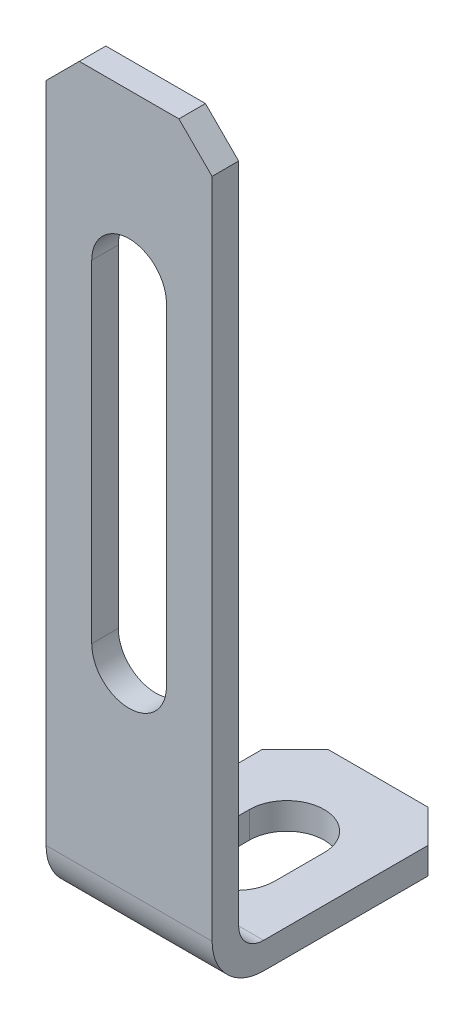
ISO-10303-21;
HEADER;
FILE_DESCRIPTION(('STEP AP214'),'2;1');
FILE_NAME('part.step','',(''),(''),'','','');
FILE_SCHEMA(('AUTOMOTIVE_DESIGN { 1 0 10303 214 1 1 1 1 }'));
ENDSEC;
DATA;
#1=APPLICATION_CONTEXT('core data for automotive mechanical design processes');
#2=APPLICATION_PROTOCOL_DEFINITION('international standard','automotive_design',2000,#1);
#3=PRODUCT_CONTEXT('',#1,'mechanical');
#4=PRODUCT('Part','Part','',(#3));
#5=PRODUCT_RELATED_PRODUCT_CATEGORY('part','',(#4));
#6=PRODUCT_DEFINITION_FORMATION('','',#4);
#7=PRODUCT_DEFINITION_CONTEXT('part definition',#1,'design');
#8=PRODUCT_DEFINITION('design','',#6,#7);
#9=PRODUCT_DEFINITION_SHAPE('','',#8);
#10=(LENGTH_UNIT() NAMED_UNIT(*) SI_UNIT(.MILLI.,.METRE.));
#11=(NAMED_UNIT(*) PLANE_ANGLE_UNIT() SI_UNIT($,.RADIAN.));
#12=(NAMED_UNIT(*) SI_UNIT($,.STERADIAN.) SOLID_ANGLE_UNIT());
#13=UNCERTAINTY_MEASURE_WITH_UNIT(LENGTH_MEASURE(1.E-05),#10,'distance_accuracy_value','');
#14=(GEOMETRIC_REPRESENTATION_CONTEXT(3) GLOBAL_UNCERTAINTY_ASSIGNED_CONTEXT((#13)) GLOBAL_UNIT_ASSIGNED_CONTEXT((#10,
#11,#12)) REPRESENTATION_CONTEXT('',''));
#15=CARTESIAN_POINT('',(0.,0.,0.));
#16=DIRECTION('',(0.,0.,1.));
#17=DIRECTION('',(1.,0.,0.));
#18=AXIS2_PLACEMENT_3D('',#15,#16,#17);
#19=CARTESIAN_POINT('',(0.,45.,-15.));
#20=DIRECTION('',(0.,1.,0.));
#21=DIRECTION('',(0.,0.,1.));
#22=AXIS2_PLACEMENT_3D('',#19,#20,#21);
#23=PLANE('',#22);
#24=DIRECTION('',(-1.,0.,0.));
#25=VECTOR('',#24,1.);
#26=CARTESIAN_POINT('',(10.,45.,-1.6));
#27=LINE('',#26,#25);
#28=CARTESIAN_POINT('',(8.00000000000001,45.,-1.6));
#29=VERTEX_POINT('',#28);
#30=CARTESIAN_POINT('',(1.99999999999999,45.,-1.6));
#31=VERTEX_POINT('',#30);
#32=EDGE_CURVE('E245',#29,#31,#27,.T.);
#33=ORIENTED_EDGE('',*,*,#32,.T.);
#34=DIRECTION('',(0.,0.,1.));
#35=VECTOR('',#34,1.);
#36=CARTESIAN_POINT('',(1.99999999999999,45.,0.));
#37=LINE('',#36,#35);
#38=CARTESIAN_POINT('',(1.99999999999999,45.,0.));
#39=VERTEX_POINT('',#38);
#40=EDGE_CURVE('E276',#31,#39,#37,.T.);
#41=ORIENTED_EDGE('',*,*,#40,.T.);
#42=DIRECTION('',(1.,0.,0.));
#43=VECTOR('',#42,1.);
#44=CARTESIAN_POINT('',(0.,45.,0.));
#45=LINE('',#44,#43);
#46=CARTESIAN_POINT('',(8.00000000000001,45.,0.));
#47=VERTEX_POINT('',#46);
#48=EDGE_CURVE('E257',#39,#47,#45,.T.);
#49=ORIENTED_EDGE('',*,*,#48,.T.);
#50=DIRECTION('',(0.,0.,-1.));
#51=VECTOR('',#50,1.);
#52=CARTESIAN_POINT('',(8.00000000000001,45.,-15.));
#53=LINE('',#52,#51);
#54=EDGE_CURVE('E274',#47,#29,#53,.T.);
#55=ORIENTED_EDGE('',*,*,#54,.T.);
#56=EDGE_LOOP('',(#33,#41,#49,#55));
#57=FACE_BOUND('',#56,.T.);
#58=ADVANCED_FACE('F32',(#57),#23,.T.);
#59=CARTESIAN_POINT('',(0.,0.,-15.));
#60=DIRECTION('',(0.,0.,-1.));
#61=DIRECTION('',(-1.,0.,0.));
#62=AXIS2_PLACEMENT_3D('',#59,#60,#61);
#63=PLANE('',#62);
#64=DIRECTION('',(1.,0.,0.));
#65=VECTOR('',#64,1.);
#66=CARTESIAN_POINT('',(0.,0.,-15.));
#67=LINE('',#66,#65);
#68=CARTESIAN_POINT('',(1.99999999999999,0.,-15.));
#69=VERTEX_POINT('',#68);
#70=CARTESIAN_POINT('',(8.,0.,-15.));
#71=VERTEX_POINT('',#70);
#72=EDGE_CURVE('E260',#69,#71,#67,.T.);
#73=ORIENTED_EDGE('',*,*,#72,.F.);
#74=DIRECTION('',(0.,1.,0.));
#75=VECTOR('',#74,1.);
#76=CARTESIAN_POINT('',(1.99999999999999,1.6,-15.));
#77=LINE('',#76,#75);
#78=CARTESIAN_POINT('',(1.99999999999999,1.6,-15.));
#79=VERTEX_POINT('',#78);
#80=EDGE_CURVE('E296',#69,#79,#77,.T.);
#81=ORIENTED_EDGE('',*,*,#80,.T.);
#82=DIRECTION('',(-1.,0.,0.));
#83=VECTOR('',#82,1.);
#84=CARTESIAN_POINT('',(10.,1.6,-15.));
#85=LINE('',#84,#83);
#86=CARTESIAN_POINT('',(8.00000000000001,1.6,-15.));
#87=VERTEX_POINT('',#86);
#88=EDGE_CURVE('E241',#87,#79,#85,.T.);
#89=ORIENTED_EDGE('',*,*,#88,.F.);
#90=DIRECTION('',(0.,-1.,0.));
#91=VECTOR('',#90,1.);
#92=CARTESIAN_POINT('',(8.00000000000001,0.,-15.));
#93=LINE('',#92,#91);
#94=EDGE_CURVE('E294',#87,#71,#93,.T.);
#95=ORIENTED_EDGE('',*,*,#94,.T.);
#96=EDGE_LOOP('',(#73,#81,#89,#95));
#97=FACE_BOUND('',#96,.T.);
#98=ADVANCED_FACE('F356',(#97),#63,.T.);
#99=CARTESIAN_POINT('',(0.,0.,0.));
#100=DIRECTION('',(0.,-1.,0.));
#101=DIRECTION('',(0.,0.,-1.));
#102=AXIS2_PLACEMENT_3D('',#99,#100,#101);
#103=PLANE('',#102);
#104=CARTESIAN_POINT('',(5.,0.,-9.5));
#105=DIRECTION('',(0.,1.,0.));
#106=DIRECTION('',(0.,0.,1.));
#107=AXIS2_PLACEMENT_3D('',#104,#105,#106);
#108=CIRCLE('',#107,2.25);
#109=CARTESIAN_POINT('',(7.25,0.,-9.5));
#110=VERTEX_POINT('',#109);
#111=CARTESIAN_POINT('',(2.75,0.,-9.5));
#112=VERTEX_POINT('',#111);
#113=EDGE_CURVE('E203',#110,#112,#108,.T.);
#114=ORIENTED_EDGE('',*,*,#113,.T.);
#115=DIRECTION('',(0.,0.,1.));
#116=VECTOR('',#115,1.);
#117=CARTESIAN_POINT('',(2.75,0.,-9.5));
#118=LINE('',#117,#116);
#119=CARTESIAN_POINT('',(2.75,0.,-6.5));
#120=VERTEX_POINT('',#119);
#121=EDGE_CURVE('E206',#112,#120,#118,.T.);
#122=ORIENTED_EDGE('',*,*,#121,.T.);
#123=CARTESIAN_POINT('',(5.,0.,-6.5));
#124=DIRECTION('',(0.,1.,0.));
#125=DIRECTION('',(0.,0.,1.));
#126=AXIS2_PLACEMENT_3D('',#123,#124,#125);
#127=CIRCLE('',#126,2.25);
#128=CARTESIAN_POINT('',(7.25,0.,-6.5));
#129=VERTEX_POINT('',#128);
#130=EDGE_CURVE('E210',#120,#129,#127,.T.);
#131=ORIENTED_EDGE('',*,*,#130,.T.);
#132=DIRECTION('',(0.,0.,-1.));
#133=VECTOR('',#132,1.);
#134=CARTESIAN_POINT('',(7.25,0.,-6.5));
#135=LINE('',#134,#133);
#136=EDGE_CURVE('E213',#129,#110,#135,.T.);
#137=ORIENTED_EDGE('',*,*,#136,.T.);
#138=EDGE_LOOP('',(#114,#122,#131,#137));
#139=FACE_BOUND('',#138,.T.);
#140=DIRECTION('',(0.,0.,-1.));
#141=VECTOR('',#140,1.);
#142=CARTESIAN_POINT('',(10.,0.,0.));
#143=LINE('',#142,#141);
#144=CARTESIAN_POINT('',(10.,0.,-3.1));
#145=VERTEX_POINT('',#144);
#146=CARTESIAN_POINT('',(10.,0.,-13.));
#147=VERTEX_POINT('',#146);
#148=EDGE_CURVE('E255',#145,#147,#143,.T.);
#149=ORIENTED_EDGE('',*,*,#148,.F.);
#150=DIRECTION('',(1.,0.,0.));
#151=VECTOR('',#150,1.);
#152=CARTESIAN_POINT('',(0.,0.,-3.1));
#153=LINE('',#152,#151);
#154=CARTESIAN_POINT('',(0.,0.,-3.1));
#155=VERTEX_POINT('',#154);
#156=EDGE_CURVE('E40',#145,#155,#153,.F.);
#157=ORIENTED_EDGE('',*,*,#156,.T.);
#158=DIRECTION('',(0.,0.,-1.));
#159=VECTOR('',#158,1.);
#160=CARTESIAN_POINT('',(0.,0.,0.));
#161=LINE('',#160,#159);
#162=CARTESIAN_POINT('',(0.,0.,-13.));
#163=VERTEX_POINT('',#162);
#164=EDGE_CURVE('E254',#155,#163,#161,.T.);
#165=ORIENTED_EDGE('',*,*,#164,.T.);
#166=DIRECTION('',(0.707106781186546,0.,-0.707106781186549));
#167=VECTOR('',#166,1.);
#168=CARTESIAN_POINT('',(-6.5,0.,-6.49999999999998));
#169=LINE('',#168,#167);
#170=EDGE_CURVE('E306',#163,#69,#169,.T.);
#171=ORIENTED_EDGE('',*,*,#170,.T.);
#172=ORIENTED_EDGE('',*,*,#72,.T.);
#173=DIRECTION('',(-0.707106781186549,0.,-0.707106781186546));
#174=VECTOR('',#173,1.);
#175=CARTESIAN_POINT('',(11.5,0.,-11.5));
#176=LINE('',#175,#174);
#177=EDGE_CURVE('E303',#71,#147,#176,.F.);
#178=ORIENTED_EDGE('',*,*,#177,.T.);
#179=EDGE_LOOP('',(#149,#157,#165,#171,#172,#178));
#180=FACE_BOUND('',#179,.T.);
#181=ADVANCED_FACE('F361',(#139,#180),#103,.T.);
#182=CARTESIAN_POINT('',(0.,45.,0.));
#183=DIRECTION('',(0.,0.,1.));
#184=DIRECTION('',(1.,0.,0.));
#185=AXIS2_PLACEMENT_3D('',#182,#183,#184);
#186=PLANE('',#185);
#187=CARTESIAN_POINT('',(5.,15.,0.));
#188=DIRECTION('',(0.,0.,1.));
#189=DIRECTION('',(1.,0.,0.));
#190=AXIS2_PLACEMENT_3D('',#187,#188,#189);
#191=CIRCLE('',#190,2.25);
#192=CARTESIAN_POINT('',(2.75,15.,0.));
#193=VERTEX_POINT('',#192);
#194=CARTESIAN_POINT('',(7.25,15.,0.));
#195=VERTEX_POINT('',#194);
#196=EDGE_CURVE('E188',#193,#195,#191,.T.);
#197=ORIENTED_EDGE('',*,*,#196,.F.);
#198=DIRECTION('',(0.,-1.,0.));
#199=VECTOR('',#198,1.);
#200=CARTESIAN_POINT('',(2.75,35.,0.));
#201=LINE('',#200,#199);
#202=CARTESIAN_POINT('',(2.75,35.,0.));
#203=VERTEX_POINT('',#202);
#204=EDGE_CURVE('E193',#203,#193,#201,.T.);
#205=ORIENTED_EDGE('',*,*,#204,.F.);
#206=CARTESIAN_POINT('',(5.,35.,0.));
#207=DIRECTION('',(0.,0.,1.));
#208=DIRECTION('',(1.,0.,0.));
#209=AXIS2_PLACEMENT_3D('',#206,#207,#208);
#210=CIRCLE('',#209,2.25);
#211=CARTESIAN_POINT('',(7.25,35.,0.));
#212=VERTEX_POINT('',#211);
#213=EDGE_CURVE('E172',#212,#203,#210,.T.);
#214=ORIENTED_EDGE('',*,*,#213,.F.);
#215=DIRECTION('',(0.,1.,0.));
#216=VECTOR('',#215,1.);
#217=CARTESIAN_POINT('',(7.25,15.,0.));
#218=LINE('',#217,#216);
#219=EDGE_CURVE('E183',#195,#212,#218,.T.);
#220=ORIENTED_EDGE('',*,*,#219,.F.);
#221=EDGE_LOOP('',(#197,#205,#214,#220));
#222=FACE_BOUND('',#221,.T.);
#223=DIRECTION('',(0.,-1.,0.));
#224=VECTOR('',#223,1.);
#225=CARTESIAN_POINT('',(0.,45.,0.));
#226=LINE('',#225,#224);
#227=CARTESIAN_POINT('',(0.,43.,0.));
#228=VERTEX_POINT('',#227);
#229=CARTESIAN_POINT('',(0.,3.10000000000001,0.));
#230=VERTEX_POINT('',#229);
#231=EDGE_CURVE('E251',#228,#230,#226,.T.);
#232=ORIENTED_EDGE('',*,*,#231,.T.);
#233=DIRECTION('',(1.,0.,0.));
#234=VECTOR('',#233,1.);
#235=CARTESIAN_POINT('',(0.,3.1,0.));
#236=LINE('',#235,#234);
#237=CARTESIAN_POINT('',(10.,3.10000000000001,0.));
#238=VERTEX_POINT('',#237);
#239=EDGE_CURVE('E323',#230,#238,#236,.T.);
#240=ORIENTED_EDGE('',*,*,#239,.T.);
#241=DIRECTION('',(0.,-1.,0.));
#242=VECTOR('',#241,1.);
#243=CARTESIAN_POINT('',(10.,45.,0.));
#244=LINE('',#243,#242);
#245=CARTESIAN_POINT('',(10.,43.,0.));
#246=VERTEX_POINT('',#245);
#247=EDGE_CURVE('E248',#246,#238,#244,.T.);
#248=ORIENTED_EDGE('',*,*,#247,.F.);
#249=DIRECTION('',(0.70710678118655,-0.707106781186545,0.));
#250=VECTOR('',#249,1.);
#251=CARTESIAN_POINT('',(3.99999999999998,49.,0.));
#252=LINE('',#251,#250);
#253=EDGE_CURVE('E279',#246,#47,#252,.F.);
#254=ORIENTED_EDGE('',*,*,#253,.T.);
#255=ORIENTED_EDGE('',*,*,#48,.F.);
#256=DIRECTION('',(-0.707106781186546,-0.707106781186549,0.));
#257=VECTOR('',#256,1.);
#258=CARTESIAN_POINT('',(0.999999999999997,44.,0.));
#259=LINE('',#258,#257);
#260=EDGE_CURVE('E281',#39,#228,#259,.T.);
#261=ORIENTED_EDGE('',*,*,#260,.T.);
#262=EDGE_LOOP('',(#232,#240,#248,#254,#255,#261));
#263=FACE_BOUND('',#262,.T.);
#264=ADVANCED_FACE('F190',(#222,#263),#186,.T.);
#265=CARTESIAN_POINT('',(0.,0.,0.));
#266=DIRECTION('',(1.,0.,0.));
#267=DIRECTION('',(0.,0.,-1.));
#268=AXIS2_PLACEMENT_3D('',#265,#266,#267);
#269=PLANE('',#268);
#270=ORIENTED_EDGE('',*,*,#164,.F.);
#271=CARTESIAN_POINT('',(0.,3.1,-3.1));
#272=DIRECTION('',(1.,0.,0.));
#273=DIRECTION('',(0.,0.,-1.));
#274=AXIS2_PLACEMENT_3D('',#271,#272,#273);
#275=CIRCLE('',#274,3.1);
#276=EDGE_CURVE('E11',#155,#230,#275,.F.);
#277=ORIENTED_EDGE('',*,*,#276,.T.);
#278=ORIENTED_EDGE('',*,*,#231,.F.);
#279=DIRECTION('',(0.,0.,-1.));
#280=VECTOR('',#279,1.);
#281=CARTESIAN_POINT('',(0.,43.,-1.6));
#282=LINE('',#281,#280);
#283=CARTESIAN_POINT('',(0.,43.,-1.6));
#284=VERTEX_POINT('',#283);
#285=EDGE_CURVE('E286',#228,#284,#282,.T.);
#286=ORIENTED_EDGE('',*,*,#285,.T.);
#287=DIRECTION('',(0.,1.,0.));
#288=VECTOR('',#287,1.);
#289=CARTESIAN_POINT('',(0.,1.6,-1.6));
#290=LINE('',#289,#288);
#291=CARTESIAN_POINT('',(0.,3.1,-1.6));
#292=VERTEX_POINT('',#291);
#293=EDGE_CURVE('E239',#292,#284,#290,.T.);
#294=ORIENTED_EDGE('',*,*,#293,.F.);
#295=CARTESIAN_POINT('',(0.,3.1,-3.1));
#296=DIRECTION('',(1.,0.,0.));
#297=DIRECTION('',(0.,0.,-1.));
#298=AXIS2_PLACEMENT_3D('',#295,#296,#297);
#299=CIRCLE('',#298,1.5);
#300=CARTESIAN_POINT('',(0.,1.6,-3.1));
#301=VERTEX_POINT('',#300);
#302=EDGE_CURVE('E319',#292,#301,#299,.T.);
#303=ORIENTED_EDGE('',*,*,#302,.T.);
#304=DIRECTION('',(0.,0.,1.));
#305=VECTOR('',#304,1.);
#306=CARTESIAN_POINT('',(0.,1.6,-15.));
#307=LINE('',#306,#305);
#308=CARTESIAN_POINT('',(0.,1.6,-13.));
#309=VERTEX_POINT('',#308);
#310=EDGE_CURVE('E228',#309,#301,#307,.T.);
#311=ORIENTED_EDGE('',*,*,#310,.F.);
#312=DIRECTION('',(0.,-1.,0.));
#313=VECTOR('',#312,1.);
#314=CARTESIAN_POINT('',(0.,0.,-13.));
#315=LINE('',#314,#313);
#316=EDGE_CURVE('E283',#309,#163,#315,.T.);
#317=ORIENTED_EDGE('',*,*,#316,.T.);
#318=EDGE_LOOP('',(#270,#277,#278,#286,#294,#303,#311,#317));
#319=FACE_BOUND('',#318,.T.);
#320=ADVANCED_FACE('F347',(#319),#269,.F.);
#321=CARTESIAN_POINT('',(10.,0.,0.));
#322=DIRECTION('',(1.,0.,0.));
#323=DIRECTION('',(0.,0.,-1.));
#324=AXIS2_PLACEMENT_3D('',#321,#322,#323);
#325=PLANE('',#324);
#326=ORIENTED_EDGE('',*,*,#247,.T.);
#327=CARTESIAN_POINT('',(10.,3.1,-3.1));
#328=DIRECTION('',(1.,0.,0.));
#329=DIRECTION('',(0.,0.,-1.));
#330=AXIS2_PLACEMENT_3D('',#327,#328,#329);
#331=CIRCLE('',#330,3.1);
#332=EDGE_CURVE('E54',#238,#145,#331,.T.);
#333=ORIENTED_EDGE('',*,*,#332,.T.);
#334=ORIENTED_EDGE('',*,*,#148,.T.);
#335=DIRECTION('',(0.,1.,0.));
#336=VECTOR('',#335,1.);
#337=CARTESIAN_POINT('',(10.,0.,-13.));
#338=LINE('',#337,#336);
#339=CARTESIAN_POINT('',(10.,1.6,-13.));
#340=VERTEX_POINT('',#339);
#341=EDGE_CURVE('E311',#147,#340,#338,.T.);
#342=ORIENTED_EDGE('',*,*,#341,.T.);
#343=DIRECTION('',(0.,0.,1.));
#344=VECTOR('',#343,1.);
#345=CARTESIAN_POINT('',(10.,1.6,-15.));
#346=LINE('',#345,#344);
#347=CARTESIAN_POINT('',(10.,1.6,-3.1));
#348=VERTEX_POINT('',#347);
#349=EDGE_CURVE('E235',#340,#348,#346,.T.);
#350=ORIENTED_EDGE('',*,*,#349,.T.);
#351=CARTESIAN_POINT('',(10.,3.1,-3.1));
#352=DIRECTION('',(1.,0.,0.));
#353=DIRECTION('',(0.,0.,-1.));
#354=AXIS2_PLACEMENT_3D('',#351,#352,#353);
#355=CIRCLE('',#354,1.5);
#356=CARTESIAN_POINT('',(10.,3.1,-1.6));
#357=VERTEX_POINT('',#356);
#358=EDGE_CURVE('E321',#348,#357,#355,.F.);
#359=ORIENTED_EDGE('',*,*,#358,.T.);
#360=DIRECTION('',(0.,1.,0.));
#361=VECTOR('',#360,1.);
#362=CARTESIAN_POINT('',(10.,1.6,-1.6));
#363=LINE('',#362,#361);
#364=CARTESIAN_POINT('',(10.,43.,-1.6));
#365=VERTEX_POINT('',#364);
#366=EDGE_CURVE('E238',#357,#365,#363,.T.);
#367=ORIENTED_EDGE('',*,*,#366,.T.);
#368=DIRECTION('',(0.,0.,1.));
#369=VECTOR('',#368,1.);
#370=CARTESIAN_POINT('',(10.,43.,0.));
#371=LINE('',#370,#369);
#372=EDGE_CURVE('E308',#365,#246,#371,.T.);
#373=ORIENTED_EDGE('',*,*,#372,.T.);
#374=EDGE_LOOP('',(#326,#333,#334,#342,#350,#359,#367,#373));
#375=FACE_BOUND('',#374,.T.);
#376=ADVANCED_FACE('F331',(#375),#325,.T.);
#377=CARTESIAN_POINT('',(10.,1.6,-1.6));
#378=DIRECTION('',(0.,0.,1.));
#379=DIRECTION('',(1.,0.,0.));
#380=AXIS2_PLACEMENT_3D('',#377,#378,#379);
#381=PLANE('',#380);
#382=DIRECTION('',(0.,-1.,0.));
#383=VECTOR('',#382,1.);
#384=CARTESIAN_POINT('',(2.75,1.6,-1.6));
#385=LINE('',#384,#383);
#386=CARTESIAN_POINT('',(2.75,35.,-1.6));
#387=VERTEX_POINT('',#386);
#388=CARTESIAN_POINT('',(2.75,15.,-1.6));
#389=VERTEX_POINT('',#388);
#390=EDGE_CURVE('E268',#387,#389,#385,.T.);
#391=ORIENTED_EDGE('',*,*,#390,.T.);
#392=CARTESIAN_POINT('',(5.,15.,-1.6));
#393=DIRECTION('',(0.,0.,1.));
#394=DIRECTION('',(1.,0.,0.));
#395=AXIS2_PLACEMENT_3D('',#392,#393,#394);
#396=CIRCLE('',#395,2.25);
#397=CARTESIAN_POINT('',(7.25,15.,-1.6));
#398=VERTEX_POINT('',#397);
#399=EDGE_CURVE('E271',#389,#398,#396,.T.);
#400=ORIENTED_EDGE('',*,*,#399,.T.);
#401=DIRECTION('',(0.,1.,0.));
#402=VECTOR('',#401,1.);
#403=CARTESIAN_POINT('',(7.25,1.6,-1.6));
#404=LINE('',#403,#402);
#405=CARTESIAN_POINT('',(7.25,35.,-1.6));
#406=VERTEX_POINT('',#405);
#407=EDGE_CURVE('E263',#398,#406,#404,.T.);
#408=ORIENTED_EDGE('',*,*,#407,.T.);
#409=CARTESIAN_POINT('',(5.,35.,-1.6));
#410=DIRECTION('',(0.,0.,1.));
#411=DIRECTION('',(1.,0.,0.));
#412=AXIS2_PLACEMENT_3D('',#409,#410,#411);
#413=CIRCLE('',#412,2.25);
#414=EDGE_CURVE('E175',#406,#387,#413,.T.);
#415=ORIENTED_EDGE('',*,*,#414,.T.);
#416=EDGE_LOOP('',(#391,#400,#408,#415));
#417=FACE_BOUND('',#416,.T.);
#418=ORIENTED_EDGE('',*,*,#366,.F.);
#419=DIRECTION('',(-1.,0.,0.));
#420=VECTOR('',#419,1.);
#421=CARTESIAN_POINT('',(0.,3.1,-1.6));
#422=LINE('',#421,#420);
#423=EDGE_CURVE('E314',#357,#292,#422,.T.);
#424=ORIENTED_EDGE('',*,*,#423,.T.);
#425=ORIENTED_EDGE('',*,*,#293,.T.);
#426=DIRECTION('',(0.707106781186546,0.707106781186549,0.));
#427=VECTOR('',#426,1.);
#428=CARTESIAN_POINT('',(1.99999999999999,45.,-1.6));
#429=LINE('',#428,#427);
#430=EDGE_CURVE('E292',#284,#31,#429,.T.);
#431=ORIENTED_EDGE('',*,*,#430,.T.);
#432=ORIENTED_EDGE('',*,*,#32,.F.);
#433=DIRECTION('',(-0.70710678118655,0.707106781186545,0.));
#434=VECTOR('',#433,1.);
#435=CARTESIAN_POINT('',(10.,43.,-1.6));
#436=LINE('',#435,#434);
#437=EDGE_CURVE('E289',#29,#365,#436,.F.);
#438=ORIENTED_EDGE('',*,*,#437,.T.);
#439=EDGE_LOOP('',(#418,#424,#425,#431,#432,#438));
#440=FACE_BOUND('',#439,.T.);
#441=ADVANCED_FACE('F425',(#417,#440),#381,.F.);
#442=CARTESIAN_POINT('',(10.,1.6,-15.));
#443=DIRECTION('',(0.,-1.,0.));
#444=DIRECTION('',(0.,0.,-1.));
#445=AXIS2_PLACEMENT_3D('',#442,#443,#444);
#446=PLANE('',#445);
#447=DIRECTION('',(0.,0.,1.));
#448=VECTOR('',#447,1.);
#449=CARTESIAN_POINT('',(2.75,1.6,-9.5));
#450=LINE('',#449,#448);
#451=CARTESIAN_POINT('',(2.75,1.6,-9.5));
#452=VERTEX_POINT('',#451);
#453=CARTESIAN_POINT('',(2.75,1.6,-6.5));
#454=VERTEX_POINT('',#453);
#455=EDGE_CURVE('E218',#452,#454,#450,.T.);
#456=ORIENTED_EDGE('',*,*,#455,.F.);
#457=CARTESIAN_POINT('',(5.,1.6,-9.5));
#458=DIRECTION('',(0.,1.,0.));
#459=DIRECTION('',(0.,0.,1.));
#460=AXIS2_PLACEMENT_3D('',#457,#458,#459);
#461=CIRCLE('',#460,2.25);
#462=CARTESIAN_POINT('',(7.25,1.6,-9.5));
#463=VERTEX_POINT('',#462);
#464=EDGE_CURVE('E200',#463,#452,#461,.T.);
#465=ORIENTED_EDGE('',*,*,#464,.F.);
#466=DIRECTION('',(0.,0.,-1.));
#467=VECTOR('',#466,1.);
#468=CARTESIAN_POINT('',(7.25,1.6,-6.5));
#469=LINE('',#468,#467);
#470=CARTESIAN_POINT('',(7.25,1.6,-6.5));
#471=VERTEX_POINT('',#470);
#472=EDGE_CURVE('E207',#471,#463,#469,.T.);
#473=ORIENTED_EDGE('',*,*,#472,.F.);
#474=CARTESIAN_POINT('',(5.,1.6,-6.5));
#475=DIRECTION('',(0.,1.,0.));
#476=DIRECTION('',(0.,0.,1.));
#477=AXIS2_PLACEMENT_3D('',#474,#475,#476);
#478=CIRCLE('',#477,2.25);
#479=EDGE_CURVE('E221',#454,#471,#478,.T.);
#480=ORIENTED_EDGE('',*,*,#479,.F.);
#481=EDGE_LOOP('',(#456,#465,#473,#480));
#482=FACE_BOUND('',#481,.T.);
#483=ORIENTED_EDGE('',*,*,#310,.T.);
#484=DIRECTION('',(-1.,0.,0.));
#485=VECTOR('',#484,1.);
#486=CARTESIAN_POINT('',(10.,1.6,-3.1));
#487=LINE('',#486,#485);
#488=EDGE_CURVE('E317',#301,#348,#487,.F.);
#489=ORIENTED_EDGE('',*,*,#488,.T.);
#490=ORIENTED_EDGE('',*,*,#349,.F.);
#491=DIRECTION('',(0.707106781186549,0.,0.707106781186546));
#492=VECTOR('',#491,1.);
#493=CARTESIAN_POINT('',(10.,1.6,-13.));
#494=LINE('',#493,#492);
#495=EDGE_CURVE('E299',#340,#87,#494,.F.);
#496=ORIENTED_EDGE('',*,*,#495,.T.);
#497=ORIENTED_EDGE('',*,*,#88,.T.);
#498=DIRECTION('',(-0.707106781186546,0.,0.707106781186549));
#499=VECTOR('',#498,1.);
#500=CARTESIAN_POINT('',(1.99999999999999,1.6,-15.));
#501=LINE('',#500,#499);
#502=EDGE_CURVE('E301',#79,#309,#501,.T.);
#503=ORIENTED_EDGE('',*,*,#502,.T.);
#504=EDGE_LOOP('',(#483,#489,#490,#496,#497,#503));
#505=FACE_BOUND('',#504,.T.);
#506=ADVANCED_FACE('F394',(#482,#505),#446,.F.);
#507=CARTESIAN_POINT('',(5.,0.,-9.5));
#508=DIRECTION('',(0.,1.,0.));
#509=DIRECTION('',(0.,0.,1.));
#510=AXIS2_PLACEMENT_3D('',#507,#508,#509);
#511=CYLINDRICAL_SURFACE('',#510,2.25);
#512=ORIENTED_EDGE('',*,*,#464,.T.);
#513=DIRECTION('',(0.,1.,0.));
#514=VECTOR('',#513,1.);
#515=CARTESIAN_POINT('',(2.75,0.,-9.5));
#516=LINE('',#515,#514);
#517=EDGE_CURVE('E216',#112,#452,#516,.T.);
#518=ORIENTED_EDGE('',*,*,#517,.F.);
#519=ORIENTED_EDGE('',*,*,#113,.F.);
#520=DIRECTION('',(0.,1.,0.));
#521=VECTOR('',#520,1.);
#522=CARTESIAN_POINT('',(7.25,0.,-9.5));
#523=LINE('',#522,#521);
#524=EDGE_CURVE('E226',#110,#463,#523,.T.);
#525=ORIENTED_EDGE('',*,*,#524,.T.);
#526=EDGE_LOOP('',(#512,#518,#519,#525));
#527=FACE_BOUND('',#526,.T.);
#528=ADVANCED_FACE('F441',(#527),#511,.F.);
#529=CARTESIAN_POINT('',(7.25,0.,-6.5));
#530=DIRECTION('',(1.,0.,0.));
#531=DIRECTION('',(0.,0.,-1.));
#532=AXIS2_PLACEMENT_3D('',#529,#530,#531);
#533=PLANE('',#532);
#534=ORIENTED_EDGE('',*,*,#472,.T.);
#535=ORIENTED_EDGE('',*,*,#524,.F.);
#536=ORIENTED_EDGE('',*,*,#136,.F.);
#537=DIRECTION('',(0.,1.,0.));
#538=VECTOR('',#537,1.);
#539=CARTESIAN_POINT('',(7.25,0.,-6.5));
#540=LINE('',#539,#538);
#541=EDGE_CURVE('E229',#129,#471,#540,.T.);
#542=ORIENTED_EDGE('',*,*,#541,.T.);
#543=EDGE_LOOP('',(#534,#535,#536,#542));
#544=FACE_BOUND('',#543,.T.);
#545=ADVANCED_FACE('F447',(#544),#533,.F.);
#546=CARTESIAN_POINT('',(5.,0.,-6.5));
#547=DIRECTION('',(0.,1.,0.));
#548=DIRECTION('',(0.,0.,1.));
#549=AXIS2_PLACEMENT_3D('',#546,#547,#548);
#550=CYLINDRICAL_SURFACE('',#549,2.25);
#551=ORIENTED_EDGE('',*,*,#479,.T.);
#552=ORIENTED_EDGE('',*,*,#541,.F.);
#553=ORIENTED_EDGE('',*,*,#130,.F.);
#554=DIRECTION('',(0.,1.,0.));
#555=VECTOR('',#554,1.);
#556=CARTESIAN_POINT('',(2.75,0.,-6.5));
#557=LINE('',#556,#555);
#558=EDGE_CURVE('E231',#120,#454,#557,.T.);
#559=ORIENTED_EDGE('',*,*,#558,.T.);
#560=EDGE_LOOP('',(#551,#552,#553,#559));
#561=FACE_BOUND('',#560,.T.);
#562=ADVANCED_FACE('F455',(#561),#550,.F.);
#563=CARTESIAN_POINT('',(2.75,0.,-9.5));
#564=DIRECTION('',(-1.,0.,0.));
#565=DIRECTION('',(0.,0.,1.));
#566=AXIS2_PLACEMENT_3D('',#563,#564,#565);
#567=PLANE('',#566);
#568=ORIENTED_EDGE('',*,*,#455,.T.);
#569=ORIENTED_EDGE('',*,*,#558,.F.);
#570=ORIENTED_EDGE('',*,*,#121,.F.);
#571=ORIENTED_EDGE('',*,*,#517,.T.);
#572=EDGE_LOOP('',(#568,#569,#570,#571));
#573=FACE_BOUND('',#572,.T.);
#574=ADVANCED_FACE('F463',(#573),#567,.F.);
#575=CARTESIAN_POINT('',(5.,15.,-15.));
#576=DIRECTION('',(0.,0.,1.));
#577=DIRECTION('',(1.,0.,0.));
#578=AXIS2_PLACEMENT_3D('',#575,#576,#577);
#579=CYLINDRICAL_SURFACE('',#578,2.25);
#580=DIRECTION('',(0.,0.,1.));
#581=VECTOR('',#580,1.);
#582=CARTESIAN_POINT('',(2.75,15.,-15.));
#583=LINE('',#582,#581);
#584=EDGE_CURVE('E198',#389,#193,#583,.T.);
#585=ORIENTED_EDGE('',*,*,#584,.T.);
#586=ORIENTED_EDGE('',*,*,#196,.T.);
#587=DIRECTION('',(0.,0.,1.));
#588=VECTOR('',#587,1.);
#589=CARTESIAN_POINT('',(7.25,15.,-15.));
#590=LINE('',#589,#588);
#591=EDGE_CURVE('E179',#398,#195,#590,.T.);
#592=ORIENTED_EDGE('',*,*,#591,.F.);
#593=ORIENTED_EDGE('',*,*,#399,.F.);
#594=EDGE_LOOP('',(#585,#586,#592,#593));
#595=FACE_BOUND('',#594,.T.);
#596=ADVANCED_FACE('F471',(#595),#579,.F.);
#597=CARTESIAN_POINT('',(2.75,35.,-15.));
#598=DIRECTION('',(-1.,0.,0.));
#599=DIRECTION('',(0.,0.,1.));
#600=AXIS2_PLACEMENT_3D('',#597,#598,#599);
#601=PLANE('',#600);
#602=DIRECTION('',(0.,0.,1.));
#603=VECTOR('',#602,1.);
#604=CARTESIAN_POINT('',(2.75,35.,-15.));
#605=LINE('',#604,#603);
#606=EDGE_CURVE('E178',#387,#203,#605,.T.);
#607=ORIENTED_EDGE('',*,*,#606,.T.);
#608=ORIENTED_EDGE('',*,*,#204,.T.);
#609=ORIENTED_EDGE('',*,*,#584,.F.);
#610=ORIENTED_EDGE('',*,*,#390,.F.);
#611=EDGE_LOOP('',(#607,#608,#609,#610));
#612=FACE_BOUND('',#611,.T.);
#613=ADVANCED_FACE('F479',(#612),#601,.F.);
#614=CARTESIAN_POINT('',(5.,35.,-15.));
#615=DIRECTION('',(0.,0.,1.));
#616=DIRECTION('',(1.,0.,0.));
#617=AXIS2_PLACEMENT_3D('',#614,#615,#616);
#618=CYLINDRICAL_SURFACE('',#617,2.25);
#619=DIRECTION('',(0.,0.,1.));
#620=VECTOR('',#619,1.);
#621=CARTESIAN_POINT('',(7.25,35.,-15.));
#622=LINE('',#621,#620);
#623=EDGE_CURVE('E167',#406,#212,#622,.T.);
#624=ORIENTED_EDGE('',*,*,#623,.T.);
#625=ORIENTED_EDGE('',*,*,#213,.T.);
#626=ORIENTED_EDGE('',*,*,#606,.F.);
#627=ORIENTED_EDGE('',*,*,#414,.F.);
#628=EDGE_LOOP('',(#624,#625,#626,#627));
#629=FACE_BOUND('',#628,.T.);
#630=ADVANCED_FACE('F169',(#629),#618,.F.);
#631=CARTESIAN_POINT('',(7.25,15.,-15.));
#632=DIRECTION('',(1.,0.,0.));
#633=DIRECTION('',(0.,0.,-1.));
#634=AXIS2_PLACEMENT_3D('',#631,#632,#633);
#635=PLANE('',#634);
#636=ORIENTED_EDGE('',*,*,#591,.T.);
#637=ORIENTED_EDGE('',*,*,#219,.T.);
#638=ORIENTED_EDGE('',*,*,#623,.F.);
#639=ORIENTED_EDGE('',*,*,#407,.F.);
#640=EDGE_LOOP('',(#636,#637,#638,#639));
#641=FACE_BOUND('',#640,.T.);
#642=ADVANCED_FACE('F184',(#641),#635,.F.);
#643=CARTESIAN_POINT('',(1.99999999999999,45.,-15.));
#644=DIRECTION('',(-0.707106781186549,0.707106781186546,0.));
#645=DIRECTION('',(0.,0.,-1.));
#646=AXIS2_PLACEMENT_3D('',#643,#644,#645);
#647=PLANE('',#646);
#648=ORIENTED_EDGE('',*,*,#430,.F.);
#649=ORIENTED_EDGE('',*,*,#285,.F.);
#650=ORIENTED_EDGE('',*,*,#260,.F.);
#651=ORIENTED_EDGE('',*,*,#40,.F.);
#652=EDGE_LOOP('',(#648,#649,#650,#651));
#653=FACE_BOUND('',#652,.T.);
#654=ADVANCED_FACE('F344',(#653),#647,.T.);
#655=CARTESIAN_POINT('',(1.99999999999999,0.,-15.));
#656=DIRECTION('',(-0.707106781186549,0.,-0.707106781186546));
#657=DIRECTION('',(0.,-1.,0.));
#658=AXIS2_PLACEMENT_3D('',#655,#656,#657);
#659=PLANE('',#658);
#660=ORIENTED_EDGE('',*,*,#170,.F.);
#661=ORIENTED_EDGE('',*,*,#316,.F.);
#662=ORIENTED_EDGE('',*,*,#502,.F.);
#663=ORIENTED_EDGE('',*,*,#80,.F.);
#664=EDGE_LOOP('',(#660,#661,#662,#663));
#665=FACE_BOUND('',#664,.T.);
#666=ADVANCED_FACE('F369',(#665),#659,.T.);
#667=CARTESIAN_POINT('',(10.,0.,-13.));
#668=DIRECTION('',(-0.707106781186546,0.,0.707106781186549));
#669=DIRECTION('',(0.,1.,0.));
#670=AXIS2_PLACEMENT_3D('',#667,#668,#669);
#671=PLANE('',#670);
#672=ORIENTED_EDGE('',*,*,#177,.F.);
#673=ORIENTED_EDGE('',*,*,#94,.F.);
#674=ORIENTED_EDGE('',*,*,#495,.F.);
#675=ORIENTED_EDGE('',*,*,#341,.F.);
#676=EDGE_LOOP('',(#672,#673,#674,#675));
#677=FACE_BOUND('',#676,.T.);
#678=ADVANCED_FACE('F372',(#677),#671,.F.);
#679=CARTESIAN_POINT('',(10.,43.,0.));
#680=DIRECTION('',(-0.707106781186545,-0.70710678118655,0.));
#681=DIRECTION('',(0.,0.,1.));
#682=AXIS2_PLACEMENT_3D('',#679,#680,#681);
#683=PLANE('',#682);
#684=ORIENTED_EDGE('',*,*,#437,.F.);
#685=ORIENTED_EDGE('',*,*,#54,.F.);
#686=ORIENTED_EDGE('',*,*,#253,.F.);
#687=ORIENTED_EDGE('',*,*,#372,.F.);
#688=EDGE_LOOP('',(#684,#685,#686,#687));
#689=FACE_BOUND('',#688,.T.);
#690=ADVANCED_FACE('F336',(#689),#683,.F.);
#691=CARTESIAN_POINT('',(10.,3.1,-3.1));
#692=DIRECTION('',(1.,0.,0.));
#693=DIRECTION('',(0.,0.,-1.));
#694=AXIS2_PLACEMENT_3D('',#691,#692,#693);
#695=CYLINDRICAL_SURFACE('',#694,1.5);
#696=ORIENTED_EDGE('',*,*,#358,.F.);
#697=ORIENTED_EDGE('',*,*,#488,.F.);
#698=ORIENTED_EDGE('',*,*,#302,.F.);
#699=ORIENTED_EDGE('',*,*,#423,.F.);
#700=EDGE_LOOP('',(#696,#697,#698,#699));
#701=FACE_BOUND('',#700,.T.);
#702=ADVANCED_FACE('F350',(#701),#695,.F.);
#703=CARTESIAN_POINT('',(0.,3.1,-3.1));
#704=DIRECTION('',(1.,0.,0.));
#705=DIRECTION('',(0.,0.,-1.));
#706=AXIS2_PLACEMENT_3D('',#703,#704,#705);
#707=CYLINDRICAL_SURFACE('',#706,3.1);
#708=ORIENTED_EDGE('',*,*,#276,.F.);
#709=ORIENTED_EDGE('',*,*,#156,.F.);
#710=ORIENTED_EDGE('',*,*,#332,.F.);
#711=ORIENTED_EDGE('',*,*,#239,.F.);
#712=EDGE_LOOP('',(#708,#709,#710,#711));
#713=FACE_BOUND('',#712,.T.);
#714=ADVANCED_FACE('F34',(#713),#707,.T.);
#715=CLOSED_SHELL('',(#58,#98,#181,#264,#320,#376,#441,#506,#528,#545,#562,#574,#596,#613,#630,
#642,#654,#666,#678,#690,#702,#714));
#716=MANIFOLD_SOLID_BREP('B2',#715);
#717=ADVANCED_BREP_SHAPE_REPRESENTATION('',(#18,#716),#14);
#718=SHAPE_DEFINITION_REPRESENTATION(#9,#717);
ENDSEC;
END-ISO-10303-21;
